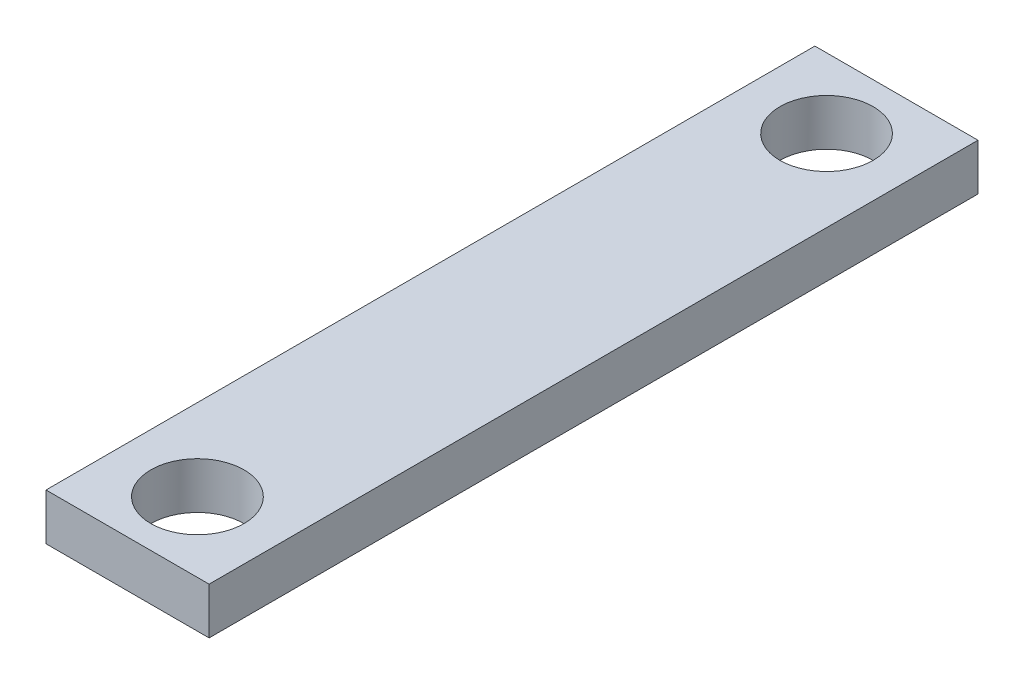
ISO-10303-21;
HEADER;
FILE_DESCRIPTION(('STEP AP214'),'2;1');
FILE_NAME('part.step','',(''),(''),'','','');
FILE_SCHEMA(('AUTOMOTIVE_DESIGN { 1 0 10303 214 1 1 1 1 }'));
ENDSEC;
DATA;
#1=APPLICATION_CONTEXT('core data for automotive mechanical design processes');
#2=APPLICATION_PROTOCOL_DEFINITION('international standard','automotive_design',2000,#1);
#3=PRODUCT_CONTEXT('',#1,'mechanical');
#4=PRODUCT('Part','Part','',(#3));
#5=PRODUCT_RELATED_PRODUCT_CATEGORY('part','',(#4));
#6=PRODUCT_DEFINITION_FORMATION('','',#4);
#7=PRODUCT_DEFINITION_CONTEXT('part definition',#1,'design');
#8=PRODUCT_DEFINITION('design','',#6,#7);
#9=PRODUCT_DEFINITION_SHAPE('','',#8);
#10=(LENGTH_UNIT() NAMED_UNIT(*) SI_UNIT(.MILLI.,.METRE.));
#11=(NAMED_UNIT(*) PLANE_ANGLE_UNIT() SI_UNIT($,.RADIAN.));
#12=(NAMED_UNIT(*) SI_UNIT($,.STERADIAN.) SOLID_ANGLE_UNIT());
#13=UNCERTAINTY_MEASURE_WITH_UNIT(LENGTH_MEASURE(1.E-05),#10,'distance_accuracy_value','');
#14=(GEOMETRIC_REPRESENTATION_CONTEXT(3) GLOBAL_UNCERTAINTY_ASSIGNED_CONTEXT((#13)) GLOBAL_UNIT_ASSIGNED_CONTEXT((#10,
#11,#12)) REPRESENTATION_CONTEXT('',''));
#15=CARTESIAN_POINT('',(0.,0.,0.));
#16=DIRECTION('',(0.,0.,1.));
#17=DIRECTION('',(1.,0.,0.));
#18=AXIS2_PLACEMENT_3D('',#15,#16,#17);
#19=CARTESIAN_POINT('',(7.,0.,33.));
#20=DIRECTION('',(0.,1.,0.));
#21=DIRECTION('',(-1.,0.,0.));
#22=AXIS2_PLACEMENT_3D('',#19,#20,#21);
#23=PLANE('',#22);
#24=CARTESIAN_POINT('',(3.5,0.,30.));
#25=DIRECTION('',(0.,1.,0.));
#26=DIRECTION('',(-1.,0.,0.));
#27=AXIS2_PLACEMENT_3D('',#24,#25,#26);
#28=CIRCLE('',#27,2.);
#29=CARTESIAN_POINT('',(1.5,0.,30.));
#30=VERTEX_POINT('',#29);
#31=EDGE_CURVE('E104',#30,#30,#28,.F.);
#32=ORIENTED_EDGE('',*,*,#31,.F.);
#33=EDGE_LOOP('',(#32));
#34=FACE_BOUND('',#33,.T.);
#35=CARTESIAN_POINT('',(3.5,0.,3.));
#36=DIRECTION('',(0.,1.,0.));
#37=DIRECTION('',(-1.,0.,0.));
#38=AXIS2_PLACEMENT_3D('',#35,#36,#37);
#39=CIRCLE('',#38,2.);
#40=CARTESIAN_POINT('',(1.5,0.,3.));
#41=VERTEX_POINT('',#40);
#42=EDGE_CURVE('E115',#41,#41,#39,.F.);
#43=ORIENTED_EDGE('',*,*,#42,.F.);
#44=EDGE_LOOP('',(#43));
#45=FACE_BOUND('',#44,.T.);
#46=DIRECTION('',(1.,0.,0.));
#47=VECTOR('',#46,1.);
#48=CARTESIAN_POINT('',(7.,0.,0.));
#49=LINE('',#48,#47);
#50=CARTESIAN_POINT('',(0.,0.,0.));
#51=VERTEX_POINT('',#50);
#52=CARTESIAN_POINT('',(7.,0.,0.));
#53=VERTEX_POINT('',#52);
#54=EDGE_CURVE('E101',#51,#53,#49,.T.);
#55=ORIENTED_EDGE('',*,*,#54,.T.);
#56=DIRECTION('',(0.,0.,-1.));
#57=VECTOR('',#56,1.);
#58=CARTESIAN_POINT('',(7.,0.,33.));
#59=LINE('',#58,#57);
#60=CARTESIAN_POINT('',(7.,0.,33.));
#61=VERTEX_POINT('',#60);
#62=EDGE_CURVE('E11',#61,#53,#59,.T.);
#63=ORIENTED_EDGE('',*,*,#62,.F.);
#64=DIRECTION('',(1.,0.,0.));
#65=VECTOR('',#64,1.);
#66=CARTESIAN_POINT('',(7.,0.,33.));
#67=LINE('',#66,#65);
#68=CARTESIAN_POINT('',(0.,0.,33.));
#69=VERTEX_POINT('',#68);
#70=EDGE_CURVE('E89',#69,#61,#67,.T.);
#71=ORIENTED_EDGE('',*,*,#70,.F.);
#72=DIRECTION('',(0.,0.,-1.));
#73=VECTOR('',#72,1.);
#74=CARTESIAN_POINT('',(0.,0.,33.));
#75=LINE('',#74,#73);
#76=EDGE_CURVE('E97',#69,#51,#75,.T.);
#77=ORIENTED_EDGE('',*,*,#76,.T.);
#78=EDGE_LOOP('',(#55,#63,#71,#77));
#79=FACE_BOUND('',#78,.T.);
#80=ADVANCED_FACE('F38',(#34,#45,#79),#23,.F.);
#81=CARTESIAN_POINT('',(7.,2.,33.));
#82=DIRECTION('',(-1.,0.,0.));
#83=DIRECTION('',(0.,0.,1.));
#84=AXIS2_PLACEMENT_3D('',#81,#82,#83);
#85=PLANE('',#84);
#86=DIRECTION('',(0.,1.,0.));
#87=VECTOR('',#86,1.);
#88=CARTESIAN_POINT('',(7.,2.,0.));
#89=LINE('',#88,#87);
#90=CARTESIAN_POINT('',(7.,2.,0.));
#91=VERTEX_POINT('',#90);
#92=EDGE_CURVE('E93',#53,#91,#89,.T.);
#93=ORIENTED_EDGE('',*,*,#92,.T.);
#94=DIRECTION('',(0.,0.,-1.));
#95=VECTOR('',#94,1.);
#96=CARTESIAN_POINT('',(7.,2.,33.));
#97=LINE('',#96,#95);
#98=CARTESIAN_POINT('',(7.,2.,33.));
#99=VERTEX_POINT('',#98);
#100=EDGE_CURVE('E46',#99,#91,#97,.T.);
#101=ORIENTED_EDGE('',*,*,#100,.F.);
#102=DIRECTION('',(0.,1.,0.));
#103=VECTOR('',#102,1.);
#104=CARTESIAN_POINT('',(7.,2.,33.));
#105=LINE('',#104,#103);
#106=EDGE_CURVE('E84',#61,#99,#105,.T.);
#107=ORIENTED_EDGE('',*,*,#106,.F.);
#108=ORIENTED_EDGE('',*,*,#62,.T.);
#109=EDGE_LOOP('',(#93,#101,#107,#108));
#110=FACE_BOUND('',#109,.T.);
#111=ADVANCED_FACE('F92',(#110),#85,.F.);
#112=CARTESIAN_POINT('',(0.,2.,33.));
#113=DIRECTION('',(0.,-1.,0.));
#114=DIRECTION('',(0.,0.,-1.));
#115=AXIS2_PLACEMENT_3D('',#112,#113,#114);
#116=PLANE('',#115);
#117=CARTESIAN_POINT('',(3.5,2.,30.));
#118=DIRECTION('',(0.,1.,0.));
#119=DIRECTION('',(0.,0.,1.));
#120=AXIS2_PLACEMENT_3D('',#117,#118,#119);
#121=CIRCLE('',#120,2.);
#122=CARTESIAN_POINT('',(3.5,2.,32.));
#123=VERTEX_POINT('',#122);
#124=EDGE_CURVE('E118',#123,#123,#121,.T.);
#125=ORIENTED_EDGE('',*,*,#124,.F.);
#126=EDGE_LOOP('',(#125));
#127=FACE_BOUND('',#126,.T.);
#128=CARTESIAN_POINT('',(3.5,2.,3.));
#129=DIRECTION('',(0.,1.,0.));
#130=DIRECTION('',(0.,0.,1.));
#131=AXIS2_PLACEMENT_3D('',#128,#129,#130);
#132=CIRCLE('',#131,2.);
#133=CARTESIAN_POINT('',(3.5,2.,5.));
#134=VERTEX_POINT('',#133);
#135=EDGE_CURVE('E119',#134,#134,#132,.T.);
#136=ORIENTED_EDGE('',*,*,#135,.F.);
#137=EDGE_LOOP('',(#136));
#138=FACE_BOUND('',#137,.T.);
#139=DIRECTION('',(-1.,0.,0.));
#140=VECTOR('',#139,1.);
#141=CARTESIAN_POINT('',(0.,2.,0.));
#142=LINE('',#141,#140);
#143=CARTESIAN_POINT('',(0.,2.,0.));
#144=VERTEX_POINT('',#143);
#145=EDGE_CURVE('E71',#91,#144,#142,.T.);
#146=ORIENTED_EDGE('',*,*,#145,.T.);
#147=DIRECTION('',(0.,0.,-1.));
#148=VECTOR('',#147,1.);
#149=CARTESIAN_POINT('',(0.,2.,33.));
#150=LINE('',#149,#148);
#151=CARTESIAN_POINT('',(0.,2.,33.));
#152=VERTEX_POINT('',#151);
#153=EDGE_CURVE('E94',#152,#144,#150,.T.);
#154=ORIENTED_EDGE('',*,*,#153,.F.);
#155=DIRECTION('',(-1.,0.,0.));
#156=VECTOR('',#155,1.);
#157=CARTESIAN_POINT('',(0.,2.,33.));
#158=LINE('',#157,#156);
#159=EDGE_CURVE('E87',#99,#152,#158,.T.);
#160=ORIENTED_EDGE('',*,*,#159,.F.);
#161=ORIENTED_EDGE('',*,*,#100,.T.);
#162=EDGE_LOOP('',(#146,#154,#160,#161));
#163=FACE_BOUND('',#162,.T.);
#164=ADVANCED_FACE('F95',(#127,#138,#163),#116,.F.);
#165=CARTESIAN_POINT('',(0.,0.,33.));
#166=DIRECTION('',(1.,0.,0.));
#167=DIRECTION('',(0.,0.,-1.));
#168=AXIS2_PLACEMENT_3D('',#165,#166,#167);
#169=PLANE('',#168);
#170=DIRECTION('',(0.,-1.,0.));
#171=VECTOR('',#170,1.);
#172=CARTESIAN_POINT('',(0.,0.,0.));
#173=LINE('',#172,#171);
#174=EDGE_CURVE('E77',#144,#51,#173,.T.);
#175=ORIENTED_EDGE('',*,*,#174,.T.);
#176=ORIENTED_EDGE('',*,*,#76,.F.);
#177=DIRECTION('',(0.,-1.,0.));
#178=VECTOR('',#177,1.);
#179=CARTESIAN_POINT('',(0.,0.,33.));
#180=LINE('',#179,#178);
#181=EDGE_CURVE('E54',#152,#69,#180,.T.);
#182=ORIENTED_EDGE('',*,*,#181,.F.);
#183=ORIENTED_EDGE('',*,*,#153,.T.);
#184=EDGE_LOOP('',(#175,#176,#182,#183));
#185=FACE_BOUND('',#184,.T.);
#186=ADVANCED_FACE('F109',(#185),#169,.F.);
#187=CARTESIAN_POINT('',(0.,0.,33.));
#188=DIRECTION('',(0.,0.,-1.));
#189=DIRECTION('',(-1.,0.,0.));
#190=AXIS2_PLACEMENT_3D('',#187,#188,#189);
#191=PLANE('',#190);
#192=ORIENTED_EDGE('',*,*,#70,.T.);
#193=ORIENTED_EDGE('',*,*,#106,.T.);
#194=ORIENTED_EDGE('',*,*,#159,.T.);
#195=ORIENTED_EDGE('',*,*,#181,.T.);
#196=EDGE_LOOP('',(#192,#193,#194,#195));
#197=FACE_BOUND('',#196,.T.);
#198=ADVANCED_FACE('F85',(#197),#191,.F.);
#199=CARTESIAN_POINT('',(0.,0.,0.));
#200=DIRECTION('',(0.,0.,-1.));
#201=DIRECTION('',(-1.,0.,0.));
#202=AXIS2_PLACEMENT_3D('',#199,#200,#201);
#203=PLANE('',#202);
#204=ORIENTED_EDGE('',*,*,#54,.F.);
#205=ORIENTED_EDGE('',*,*,#174,.F.);
#206=ORIENTED_EDGE('',*,*,#145,.F.);
#207=ORIENTED_EDGE('',*,*,#92,.F.);
#208=EDGE_LOOP('',(#204,#205,#206,#207));
#209=FACE_BOUND('',#208,.T.);
#210=ADVANCED_FACE('F112',(#209),#203,.T.);
#211=CARTESIAN_POINT('',(3.5,-0.00100000000000013,3.));
#212=DIRECTION('',(0.,1.,0.));
#213=DIRECTION('',(0.,0.,1.));
#214=AXIS2_PLACEMENT_3D('',#211,#212,#213);
#215=CYLINDRICAL_SURFACE('',#214,2.);
#216=ORIENTED_EDGE('',*,*,#135,.T.);
#217=EDGE_LOOP('',(#216));
#218=FACE_BOUND('',#217,.T.);
#219=ORIENTED_EDGE('',*,*,#42,.T.);
#220=EDGE_LOOP('',(#219));
#221=FACE_BOUND('',#220,.T.);
#222=ADVANCED_FACE('F135',(#218,#221),#215,.F.);
#223=CARTESIAN_POINT('',(3.5,-0.00100000000000013,30.));
#224=DIRECTION('',(0.,1.,0.));
#225=DIRECTION('',(0.,0.,1.));
#226=AXIS2_PLACEMENT_3D('',#223,#224,#225);
#227=CYLINDRICAL_SURFACE('',#226,2.);
#228=ORIENTED_EDGE('',*,*,#124,.T.);
#229=EDGE_LOOP('',(#228));
#230=FACE_BOUND('',#229,.T.);
#231=ORIENTED_EDGE('',*,*,#31,.T.);
#232=EDGE_LOOP('',(#231));
#233=FACE_BOUND('',#232,.T.);
#234=ADVANCED_FACE('F127',(#230,#233),#227,.F.);
#235=CLOSED_SHELL('',(#80,#111,#164,#186,#198,#210,#222,#234));
#236=MANIFOLD_SOLID_BREP('B2',#235);
#237=ADVANCED_BREP_SHAPE_REPRESENTATION('',(#18,#236),#14);
#238=SHAPE_DEFINITION_REPRESENTATION(#9,#237);
ENDSEC;
END-ISO-10303-21;
